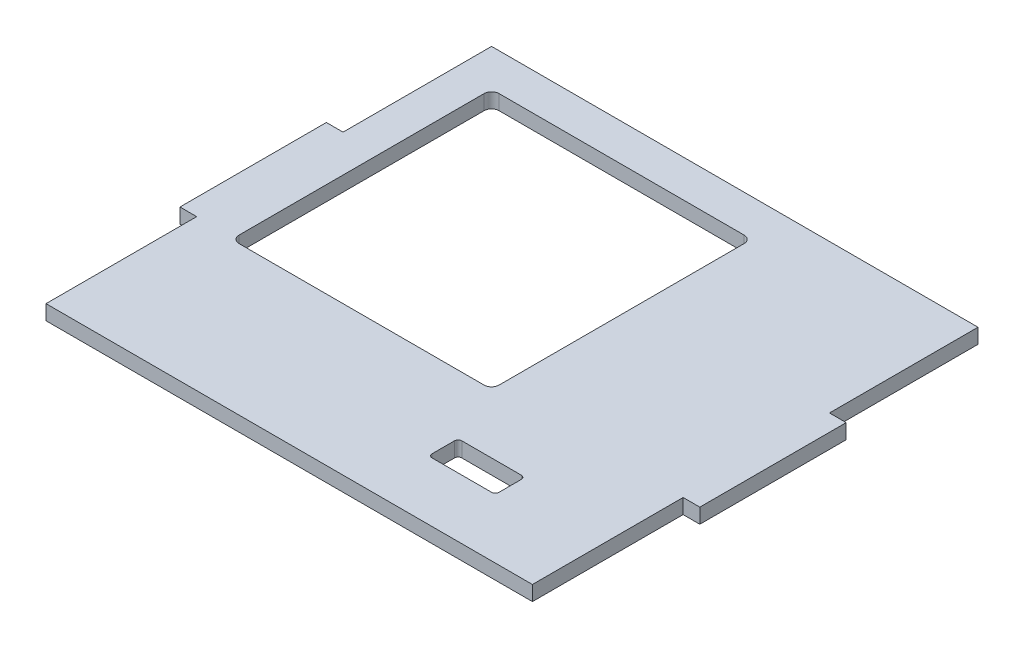
ISO-10303-21;
HEADER;
FILE_DESCRIPTION(('STEP AP214'),'2;1');
FILE_NAME('part.step','',(''),(''),'','','');
FILE_SCHEMA(('AUTOMOTIVE_DESIGN { 1 0 10303 214 1 1 1 1 }'));
ENDSEC;
DATA;
#1=APPLICATION_CONTEXT('core data for automotive mechanical design processes');
#2=APPLICATION_PROTOCOL_DEFINITION('international standard','automotive_design',2000,#1);
#3=PRODUCT_CONTEXT('',#1,'mechanical');
#4=PRODUCT('Part','Part','',(#3));
#5=PRODUCT_RELATED_PRODUCT_CATEGORY('part','',(#4));
#6=PRODUCT_DEFINITION_FORMATION('','',#4);
#7=PRODUCT_DEFINITION_CONTEXT('part definition',#1,'design');
#8=PRODUCT_DEFINITION('design','',#6,#7);
#9=PRODUCT_DEFINITION_SHAPE('','',#8);
#10=(LENGTH_UNIT() NAMED_UNIT(*) SI_UNIT(.MILLI.,.METRE.));
#11=(NAMED_UNIT(*) PLANE_ANGLE_UNIT() SI_UNIT($,.RADIAN.));
#12=(NAMED_UNIT(*) SI_UNIT($,.STERADIAN.) SOLID_ANGLE_UNIT());
#13=UNCERTAINTY_MEASURE_WITH_UNIT(LENGTH_MEASURE(1.E-05),#10,'distance_accuracy_value','');
#14=(GEOMETRIC_REPRESENTATION_CONTEXT(3) GLOBAL_UNCERTAINTY_ASSIGNED_CONTEXT((#13)) GLOBAL_UNIT_ASSIGNED_CONTEXT((#10,
#11,#12)) REPRESENTATION_CONTEXT('',''));
#15=CARTESIAN_POINT('',(0.,0.,0.));
#16=DIRECTION('',(0.,0.,1.));
#17=DIRECTION('',(1.,0.,0.));
#18=AXIS2_PLACEMENT_3D('',#15,#16,#17);
#19=CARTESIAN_POINT('',(65.5,4.,-20.));
#20=DIRECTION('',(-1.,0.,0.));
#21=DIRECTION('',(0.,0.,1.));
#22=AXIS2_PLACEMENT_3D('',#19,#20,#21);
#23=PLANE('',#22);
#24=DIRECTION('',(0.,0.,-1.));
#25=VECTOR('',#24,1.);
#26=CARTESIAN_POINT('',(65.5,0.,-20.));
#27=LINE('',#26,#25);
#28=CARTESIAN_POINT('',(65.5,0.,-20.));
#29=VERTEX_POINT('',#28);
#30=CARTESIAN_POINT('',(65.5,0.,-60.));
#31=VERTEX_POINT('',#30);
#32=EDGE_CURVE('E259',#29,#31,#27,.T.);
#33=ORIENTED_EDGE('',*,*,#32,.T.);
#34=DIRECTION('',(0.,-1.,0.));
#35=VECTOR('',#34,1.);
#36=CARTESIAN_POINT('',(65.5,4.,-60.));
#37=LINE('',#36,#35);
#38=CARTESIAN_POINT('',(65.5,4.,-60.));
#39=VERTEX_POINT('',#38);
#40=EDGE_CURVE('E390',#39,#31,#37,.T.);
#41=ORIENTED_EDGE('',*,*,#40,.F.);
#42=DIRECTION('',(0.,0.,-1.));
#43=VECTOR('',#42,1.);
#44=CARTESIAN_POINT('',(65.5,4.,-20.));
#45=LINE('',#44,#43);
#46=CARTESIAN_POINT('',(65.5,4.,-20.));
#47=VERTEX_POINT('',#46);
#48=EDGE_CURVE('E308',#47,#39,#45,.T.);
#49=ORIENTED_EDGE('',*,*,#48,.F.);
#50=DIRECTION('',(0.,-1.,0.));
#51=VECTOR('',#50,1.);
#52=CARTESIAN_POINT('',(65.5,4.,-20.));
#53=LINE('',#52,#51);
#54=EDGE_CURVE('E334',#47,#29,#53,.T.);
#55=ORIENTED_EDGE('',*,*,#54,.T.);
#56=EDGE_LOOP('',(#33,#41,#49,#55));
#57=FACE_BOUND('',#56,.T.);
#58=ADVANCED_FACE('F32',(#57),#23,.F.);
#59=CARTESIAN_POINT('',(-65.5,4.,-60.));
#60=DIRECTION('',(0.,0.,1.));
#61=DIRECTION('',(1.,0.,0.));
#62=AXIS2_PLACEMENT_3D('',#59,#60,#61);
#63=PLANE('',#62);
#64=DIRECTION('',(-1.,0.,0.));
#65=VECTOR('',#64,1.);
#66=CARTESIAN_POINT('',(-65.5,0.,-60.));
#67=LINE('',#66,#65);
#68=CARTESIAN_POINT('',(-65.5,0.,-60.));
#69=VERTEX_POINT('',#68);
#70=EDGE_CURVE('E337',#31,#69,#67,.T.);
#71=ORIENTED_EDGE('',*,*,#70,.T.);
#72=DIRECTION('',(0.,-1.,0.));
#73=VECTOR('',#72,1.);
#74=CARTESIAN_POINT('',(-65.5,4.,-60.));
#75=LINE('',#74,#73);
#76=CARTESIAN_POINT('',(-65.5,4.,-60.));
#77=VERTEX_POINT('',#76);
#78=EDGE_CURVE('E387',#77,#69,#75,.T.);
#79=ORIENTED_EDGE('',*,*,#78,.F.);
#80=DIRECTION('',(-1.,0.,0.));
#81=VECTOR('',#80,1.);
#82=CARTESIAN_POINT('',(-65.5,4.,-60.));
#83=LINE('',#82,#81);
#84=EDGE_CURVE('E311',#39,#77,#83,.T.);
#85=ORIENTED_EDGE('',*,*,#84,.F.);
#86=ORIENTED_EDGE('',*,*,#40,.T.);
#87=EDGE_LOOP('',(#71,#79,#85,#86));
#88=FACE_BOUND('',#87,.T.);
#89=ADVANCED_FACE('F462',(#88),#63,.F.);
#90=CARTESIAN_POINT('',(-65.5,4.,-20.));
#91=DIRECTION('',(1.,0.,0.));
#92=DIRECTION('',(0.,0.,-1.));
#93=AXIS2_PLACEMENT_3D('',#90,#91,#92);
#94=PLANE('',#93);
#95=DIRECTION('',(0.,0.,1.));
#96=VECTOR('',#95,1.);
#97=CARTESIAN_POINT('',(-65.5,0.,-20.));
#98=LINE('',#97,#96);
#99=CARTESIAN_POINT('',(-65.5,0.,-20.));
#100=VERTEX_POINT('',#99);
#101=EDGE_CURVE('E339',#69,#100,#98,.T.);
#102=ORIENTED_EDGE('',*,*,#101,.T.);
#103=DIRECTION('',(0.,-1.,0.));
#104=VECTOR('',#103,1.);
#105=CARTESIAN_POINT('',(-65.5,4.,-20.));
#106=LINE('',#105,#104);
#107=CARTESIAN_POINT('',(-65.5,4.,-20.));
#108=VERTEX_POINT('',#107);
#109=EDGE_CURVE('E384',#108,#100,#106,.T.);
#110=ORIENTED_EDGE('',*,*,#109,.F.);
#111=DIRECTION('',(0.,0.,1.));
#112=VECTOR('',#111,1.);
#113=CARTESIAN_POINT('',(-65.5,4.,-20.));
#114=LINE('',#113,#112);
#115=EDGE_CURVE('E314',#77,#108,#114,.T.);
#116=ORIENTED_EDGE('',*,*,#115,.F.);
#117=ORIENTED_EDGE('',*,*,#78,.T.);
#118=EDGE_LOOP('',(#102,#110,#116,#117));
#119=FACE_BOUND('',#118,.T.);
#120=ADVANCED_FACE('F467',(#119),#94,.F.);
#121=CARTESIAN_POINT('',(-65.5,4.,-20.));
#122=DIRECTION('',(0.,0.,1.));
#123=DIRECTION('',(1.,0.,0.));
#124=AXIS2_PLACEMENT_3D('',#121,#122,#123);
#125=PLANE('',#124);
#126=DIRECTION('',(-1.,0.,0.));
#127=VECTOR('',#126,1.);
#128=CARTESIAN_POINT('',(-65.5,0.,-20.));
#129=LINE('',#128,#127);
#130=CARTESIAN_POINT('',(-70.,0.,-20.));
#131=VERTEX_POINT('',#130);
#132=EDGE_CURVE('E341',#100,#131,#129,.T.);
#133=ORIENTED_EDGE('',*,*,#132,.T.);
#134=DIRECTION('',(0.,-1.,0.));
#135=VECTOR('',#134,1.);
#136=CARTESIAN_POINT('',(-70.,4.,-20.));
#137=LINE('',#136,#135);
#138=CARTESIAN_POINT('',(-70.,4.,-20.));
#139=VERTEX_POINT('',#138);
#140=EDGE_CURVE('E381',#139,#131,#137,.T.);
#141=ORIENTED_EDGE('',*,*,#140,.F.);
#142=DIRECTION('',(-1.,0.,0.));
#143=VECTOR('',#142,1.);
#144=CARTESIAN_POINT('',(-65.5,4.,-20.));
#145=LINE('',#144,#143);
#146=EDGE_CURVE('E316',#108,#139,#145,.T.);
#147=ORIENTED_EDGE('',*,*,#146,.F.);
#148=ORIENTED_EDGE('',*,*,#109,.T.);
#149=EDGE_LOOP('',(#133,#141,#147,#148));
#150=FACE_BOUND('',#149,.T.);
#151=ADVANCED_FACE('F520',(#150),#125,.F.);
#152=CARTESIAN_POINT('',(-70.,4.,-20.));
#153=DIRECTION('',(1.,0.,0.));
#154=DIRECTION('',(0.,0.,-1.));
#155=AXIS2_PLACEMENT_3D('',#152,#153,#154);
#156=PLANE('',#155);
#157=DIRECTION('',(0.,0.,1.));
#158=VECTOR('',#157,1.);
#159=CARTESIAN_POINT('',(-70.,0.,-20.));
#160=LINE('',#159,#158);
#161=CARTESIAN_POINT('',(-70.,0.,19.4155154362416));
#162=VERTEX_POINT('',#161);
#163=EDGE_CURVE('E343',#131,#162,#160,.T.);
#164=ORIENTED_EDGE('',*,*,#163,.T.);
#165=DIRECTION('',(0.,-1.,0.));
#166=VECTOR('',#165,1.);
#167=CARTESIAN_POINT('',(-70.,4.,19.4155154362416));
#168=LINE('',#167,#166);
#169=CARTESIAN_POINT('',(-70.,4.,19.4155154362416));
#170=VERTEX_POINT('',#169);
#171=EDGE_CURVE('E378',#170,#162,#168,.T.);
#172=ORIENTED_EDGE('',*,*,#171,.F.);
#173=DIRECTION('',(0.,0.,1.));
#174=VECTOR('',#173,1.);
#175=CARTESIAN_POINT('',(-70.,4.,-20.));
#176=LINE('',#175,#174);
#177=EDGE_CURVE('E318',#139,#170,#176,.T.);
#178=ORIENTED_EDGE('',*,*,#177,.F.);
#179=ORIENTED_EDGE('',*,*,#140,.T.);
#180=EDGE_LOOP('',(#164,#172,#178,#179));
#181=FACE_BOUND('',#180,.T.);
#182=ADVANCED_FACE('F517',(#181),#156,.F.);
#183=CARTESIAN_POINT('',(-70.,4.,19.4155154362416));
#184=DIRECTION('',(0.,0.,-1.));
#185=DIRECTION('',(-1.,0.,0.));
#186=AXIS2_PLACEMENT_3D('',#183,#184,#185);
#187=PLANE('',#186);
#188=DIRECTION('',(1.,0.,0.));
#189=VECTOR('',#188,1.);
#190=CARTESIAN_POINT('',(-70.,0.,19.4155154362416));
#191=LINE('',#190,#189);
#192=CARTESIAN_POINT('',(-65.5,0.,19.4155154362416));
#193=VERTEX_POINT('',#192);
#194=EDGE_CURVE('E345',#162,#193,#191,.T.);
#195=ORIENTED_EDGE('',*,*,#194,.T.);
#196=DIRECTION('',(0.,-1.,0.));
#197=VECTOR('',#196,1.);
#198=CARTESIAN_POINT('',(-65.5,4.,19.4155154362416));
#199=LINE('',#198,#197);
#200=CARTESIAN_POINT('',(-65.5,4.,19.4155154362416));
#201=VERTEX_POINT('',#200);
#202=EDGE_CURVE('E375',#201,#193,#199,.T.);
#203=ORIENTED_EDGE('',*,*,#202,.F.);
#204=DIRECTION('',(1.,0.,0.));
#205=VECTOR('',#204,1.);
#206=CARTESIAN_POINT('',(-70.,4.,19.4155154362416));
#207=LINE('',#206,#205);
#208=EDGE_CURVE('E320',#170,#201,#207,.T.);
#209=ORIENTED_EDGE('',*,*,#208,.F.);
#210=ORIENTED_EDGE('',*,*,#171,.T.);
#211=EDGE_LOOP('',(#195,#203,#209,#210));
#212=FACE_BOUND('',#211,.T.);
#213=ADVANCED_FACE('F513',(#212),#187,.F.);
#214=CARTESIAN_POINT('',(-65.5,4.,60.));
#215=DIRECTION('',(1.,0.,0.));
#216=DIRECTION('',(0.,0.,-1.));
#217=AXIS2_PLACEMENT_3D('',#214,#215,#216);
#218=PLANE('',#217);
#219=DIRECTION('',(0.,0.,1.));
#220=VECTOR('',#219,1.);
#221=CARTESIAN_POINT('',(-65.5,0.,60.));
#222=LINE('',#221,#220);
#223=CARTESIAN_POINT('',(-65.5,0.,60.));
#224=VERTEX_POINT('',#223);
#225=EDGE_CURVE('E347',#193,#224,#222,.T.);
#226=ORIENTED_EDGE('',*,*,#225,.T.);
#227=DIRECTION('',(0.,-1.,0.));
#228=VECTOR('',#227,1.);
#229=CARTESIAN_POINT('',(-65.5,4.,60.));
#230=LINE('',#229,#228);
#231=CARTESIAN_POINT('',(-65.5,4.,60.));
#232=VERTEX_POINT('',#231);
#233=EDGE_CURVE('E372',#232,#224,#230,.T.);
#234=ORIENTED_EDGE('',*,*,#233,.F.);
#235=DIRECTION('',(0.,0.,1.));
#236=VECTOR('',#235,1.);
#237=CARTESIAN_POINT('',(-65.5,4.,60.));
#238=LINE('',#237,#236);
#239=EDGE_CURVE('E322',#201,#232,#238,.T.);
#240=ORIENTED_EDGE('',*,*,#239,.F.);
#241=ORIENTED_EDGE('',*,*,#202,.T.);
#242=EDGE_LOOP('',(#226,#234,#240,#241));
#243=FACE_BOUND('',#242,.T.);
#244=ADVANCED_FACE('F508',(#243),#218,.F.);
#245=CARTESIAN_POINT('',(-65.5,4.,60.));
#246=DIRECTION('',(0.,0.,-1.));
#247=DIRECTION('',(-1.,0.,0.));
#248=AXIS2_PLACEMENT_3D('',#245,#246,#247);
#249=PLANE('',#248);
#250=DIRECTION('',(1.,0.,0.));
#251=VECTOR('',#250,1.);
#252=CARTESIAN_POINT('',(-65.5,0.,60.));
#253=LINE('',#252,#251);
#254=CARTESIAN_POINT('',(65.5,0.,60.));
#255=VERTEX_POINT('',#254);
#256=EDGE_CURVE('E349',#224,#255,#253,.T.);
#257=ORIENTED_EDGE('',*,*,#256,.T.);
#258=DIRECTION('',(0.,-1.,0.));
#259=VECTOR('',#258,1.);
#260=CARTESIAN_POINT('',(65.5,4.,60.));
#261=LINE('',#260,#259);
#262=CARTESIAN_POINT('',(65.5,4.,60.));
#263=VERTEX_POINT('',#262);
#264=EDGE_CURVE('E369',#263,#255,#261,.T.);
#265=ORIENTED_EDGE('',*,*,#264,.F.);
#266=DIRECTION('',(1.,0.,0.));
#267=VECTOR('',#266,1.);
#268=CARTESIAN_POINT('',(-65.5,4.,60.));
#269=LINE('',#268,#267);
#270=EDGE_CURVE('E324',#232,#263,#269,.T.);
#271=ORIENTED_EDGE('',*,*,#270,.F.);
#272=ORIENTED_EDGE('',*,*,#233,.T.);
#273=EDGE_LOOP('',(#257,#265,#271,#272));
#274=FACE_BOUND('',#273,.T.);
#275=ADVANCED_FACE('F502',(#274),#249,.F.);
#276=CARTESIAN_POINT('',(65.5,4.,60.));
#277=DIRECTION('',(-1.,0.,0.));
#278=DIRECTION('',(0.,0.,1.));
#279=AXIS2_PLACEMENT_3D('',#276,#277,#278);
#280=PLANE('',#279);
#281=DIRECTION('',(0.,0.,-1.));
#282=VECTOR('',#281,1.);
#283=CARTESIAN_POINT('',(65.5,0.,60.));
#284=LINE('',#283,#282);
#285=CARTESIAN_POINT('',(65.5,0.,19.4155154362416));
#286=VERTEX_POINT('',#285);
#287=EDGE_CURVE('E351',#255,#286,#284,.T.);
#288=ORIENTED_EDGE('',*,*,#287,.T.);
#289=DIRECTION('',(0.,-1.,0.));
#290=VECTOR('',#289,1.);
#291=CARTESIAN_POINT('',(65.5,4.,19.4155154362416));
#292=LINE('',#291,#290);
#293=CARTESIAN_POINT('',(65.5,4.,19.4155154362416));
#294=VERTEX_POINT('',#293);
#295=EDGE_CURVE('E366',#294,#286,#292,.T.);
#296=ORIENTED_EDGE('',*,*,#295,.F.);
#297=DIRECTION('',(0.,0.,-1.));
#298=VECTOR('',#297,1.);
#299=CARTESIAN_POINT('',(65.5,4.,60.));
#300=LINE('',#299,#298);
#301=EDGE_CURVE('E326',#263,#294,#300,.T.);
#302=ORIENTED_EDGE('',*,*,#301,.F.);
#303=ORIENTED_EDGE('',*,*,#264,.T.);
#304=EDGE_LOOP('',(#288,#296,#302,#303));
#305=FACE_BOUND('',#304,.T.);
#306=ADVANCED_FACE('F498',(#305),#280,.F.);
#307=CARTESIAN_POINT('',(70.,4.,19.4155154362416));
#308=DIRECTION('',(0.,0.,-1.));
#309=DIRECTION('',(-1.,0.,0.));
#310=AXIS2_PLACEMENT_3D('',#307,#308,#309);
#311=PLANE('',#310);
#312=DIRECTION('',(1.,0.,0.));
#313=VECTOR('',#312,1.);
#314=CARTESIAN_POINT('',(70.,0.,19.4155154362416));
#315=LINE('',#314,#313);
#316=CARTESIAN_POINT('',(70.,0.,19.4155154362416));
#317=VERTEX_POINT('',#316);
#318=EDGE_CURVE('E353',#286,#317,#315,.T.);
#319=ORIENTED_EDGE('',*,*,#318,.T.);
#320=DIRECTION('',(0.,-1.,0.));
#321=VECTOR('',#320,1.);
#322=CARTESIAN_POINT('',(70.,4.,19.4155154362416));
#323=LINE('',#322,#321);
#324=CARTESIAN_POINT('',(70.,4.,19.4155154362416));
#325=VERTEX_POINT('',#324);
#326=EDGE_CURVE('E363',#325,#317,#323,.T.);
#327=ORIENTED_EDGE('',*,*,#326,.F.);
#328=DIRECTION('',(1.,0.,0.));
#329=VECTOR('',#328,1.);
#330=CARTESIAN_POINT('',(70.,4.,19.4155154362416));
#331=LINE('',#330,#329);
#332=EDGE_CURVE('E328',#294,#325,#331,.T.);
#333=ORIENTED_EDGE('',*,*,#332,.F.);
#334=ORIENTED_EDGE('',*,*,#295,.T.);
#335=EDGE_LOOP('',(#319,#327,#333,#334));
#336=FACE_BOUND('',#335,.T.);
#337=ADVANCED_FACE('F493',(#336),#311,.F.);
#338=CARTESIAN_POINT('',(70.,4.,-20.));
#339=DIRECTION('',(-1.,0.,0.));
#340=DIRECTION('',(0.,0.,1.));
#341=AXIS2_PLACEMENT_3D('',#338,#339,#340);
#342=PLANE('',#341);
#343=DIRECTION('',(0.,0.,-1.));
#344=VECTOR('',#343,1.);
#345=CARTESIAN_POINT('',(70.,0.,-20.));
#346=LINE('',#345,#344);
#347=CARTESIAN_POINT('',(70.,0.,-20.));
#348=VERTEX_POINT('',#347);
#349=EDGE_CURVE('E355',#317,#348,#346,.T.);
#350=ORIENTED_EDGE('',*,*,#349,.T.);
#351=DIRECTION('',(0.,-1.,0.));
#352=VECTOR('',#351,1.);
#353=CARTESIAN_POINT('',(70.,4.,-20.));
#354=LINE('',#353,#352);
#355=CARTESIAN_POINT('',(70.,4.,-20.));
#356=VERTEX_POINT('',#355);
#357=EDGE_CURVE('E360',#356,#348,#354,.T.);
#358=ORIENTED_EDGE('',*,*,#357,.F.);
#359=DIRECTION('',(0.,0.,-1.));
#360=VECTOR('',#359,1.);
#361=CARTESIAN_POINT('',(70.,4.,-20.));
#362=LINE('',#361,#360);
#363=EDGE_CURVE('E330',#325,#356,#362,.T.);
#364=ORIENTED_EDGE('',*,*,#363,.F.);
#365=ORIENTED_EDGE('',*,*,#326,.T.);
#366=EDGE_LOOP('',(#350,#358,#364,#365));
#367=FACE_BOUND('',#366,.T.);
#368=ADVANCED_FACE('F487',(#367),#342,.F.);
#369=CARTESIAN_POINT('',(65.5,4.,-20.));
#370=DIRECTION('',(0.,0.,1.));
#371=DIRECTION('',(1.,0.,0.));
#372=AXIS2_PLACEMENT_3D('',#369,#370,#371);
#373=PLANE('',#372);
#374=DIRECTION('',(-1.,0.,0.));
#375=VECTOR('',#374,1.);
#376=CARTESIAN_POINT('',(65.5,0.,-20.));
#377=LINE('',#376,#375);
#378=EDGE_CURVE('E312',#348,#29,#377,.T.);
#379=ORIENTED_EDGE('',*,*,#378,.T.);
#380=ORIENTED_EDGE('',*,*,#54,.F.);
#381=DIRECTION('',(-1.,0.,0.));
#382=VECTOR('',#381,1.);
#383=CARTESIAN_POINT('',(65.5,4.,-20.));
#384=LINE('',#383,#382);
#385=EDGE_CURVE('E332',#356,#47,#384,.T.);
#386=ORIENTED_EDGE('',*,*,#385,.F.);
#387=ORIENTED_EDGE('',*,*,#357,.T.);
#388=EDGE_LOOP('',(#379,#380,#386,#387));
#389=FACE_BOUND('',#388,.T.);
#390=ADVANCED_FACE('F485',(#389),#373,.F.);
#391=CARTESIAN_POINT('',(0.,4.,0.));
#392=DIRECTION('',(0.,-1.,0.));
#393=DIRECTION('',(0.,0.,-1.));
#394=AXIS2_PLACEMENT_3D('',#391,#392,#393);
#395=PLANE('',#394);
#396=DIRECTION('',(-1.,0.,0.));
#397=VECTOR('',#396,1.);
#398=CARTESIAN_POINT('',(-53.5,4.,-50.));
#399=LINE('',#398,#397);
#400=CARTESIAN_POINT('',(12.5,4.,-50.));
#401=VERTEX_POINT('',#400);
#402=CARTESIAN_POINT('',(-53.5,4.,-50.));
#403=VERTEX_POINT('',#402);
#404=EDGE_CURVE('E232',#401,#403,#399,.T.);
#405=ORIENTED_EDGE('',*,*,#404,.F.);
#406=CARTESIAN_POINT('',(12.5,4.,-48.));
#407=DIRECTION('',(0.,1.,0.));
#408=DIRECTION('',(0.,0.,-1.));
#409=AXIS2_PLACEMENT_3D('',#406,#407,#408);
#410=CIRCLE('',#409,2.);
#411=CARTESIAN_POINT('',(14.5,4.,-48.));
#412=VERTEX_POINT('',#411);
#413=EDGE_CURVE('E46',#412,#401,#410,.T.);
#414=ORIENTED_EDGE('',*,*,#413,.F.);
#415=DIRECTION('',(0.,0.,-1.));
#416=VECTOR('',#415,1.);
#417=CARTESIAN_POINT('',(14.5,4.,18.));
#418=LINE('',#417,#416);
#419=CARTESIAN_POINT('',(14.5,4.,18.));
#420=VERTEX_POINT('',#419);
#421=EDGE_CURVE('E254',#420,#412,#418,.T.);
#422=ORIENTED_EDGE('',*,*,#421,.F.);
#423=CARTESIAN_POINT('',(12.5,4.,18.));
#424=DIRECTION('',(0.,1.,0.));
#425=DIRECTION('',(0.,0.,-1.));
#426=AXIS2_PLACEMENT_3D('',#423,#424,#425);
#427=CIRCLE('',#426,2.);
#428=CARTESIAN_POINT('',(12.5,4.,20.));
#429=VERTEX_POINT('',#428);
#430=EDGE_CURVE('E251',#429,#420,#427,.T.);
#431=ORIENTED_EDGE('',*,*,#430,.F.);
#432=DIRECTION('',(1.,0.,0.));
#433=VECTOR('',#432,1.);
#434=CARTESIAN_POINT('',(-53.5,4.,20.));
#435=LINE('',#434,#433);
#436=CARTESIAN_POINT('',(-53.5,4.,20.));
#437=VERTEX_POINT('',#436);
#438=EDGE_CURVE('E248',#437,#429,#435,.T.);
#439=ORIENTED_EDGE('',*,*,#438,.F.);
#440=CARTESIAN_POINT('',(-53.5,4.,18.));
#441=DIRECTION('',(0.,1.,0.));
#442=DIRECTION('',(0.,0.,-1.));
#443=AXIS2_PLACEMENT_3D('',#440,#441,#442);
#444=CIRCLE('',#443,2.);
#445=CARTESIAN_POINT('',(-55.5,4.,18.));
#446=VERTEX_POINT('',#445);
#447=EDGE_CURVE('E242',#446,#437,#444,.T.);
#448=ORIENTED_EDGE('',*,*,#447,.F.);
#449=DIRECTION('',(0.,0.,1.));
#450=VECTOR('',#449,1.);
#451=CARTESIAN_POINT('',(-55.5,4.,18.));
#452=LINE('',#451,#450);
#453=CARTESIAN_POINT('',(-55.5,4.,-48.));
#454=VERTEX_POINT('',#453);
#455=EDGE_CURVE('E240',#454,#446,#452,.T.);
#456=ORIENTED_EDGE('',*,*,#455,.F.);
#457=CARTESIAN_POINT('',(-53.5,4.,-48.));
#458=DIRECTION('',(0.,1.,0.));
#459=DIRECTION('',(0.,0.,-1.));
#460=AXIS2_PLACEMENT_3D('',#457,#458,#459);
#461=CIRCLE('',#460,2.);
#462=EDGE_CURVE('E222',#403,#454,#461,.T.);
#463=ORIENTED_EDGE('',*,*,#462,.F.);
#464=EDGE_LOOP('',(#405,#414,#422,#431,#439,#448,#456,#463));
#465=FACE_BOUND('',#464,.T.);
#466=DIRECTION('',(1.,0.,0.));
#467=VECTOR('',#466,1.);
#468=CARTESIAN_POINT('',(22.5,4.,44.));
#469=LINE('',#468,#467);
#470=CARTESIAN_POINT('',(22.5,4.,44.));
#471=VERTEX_POINT('',#470);
#472=CARTESIAN_POINT('',(38.5,4.,44.));
#473=VERTEX_POINT('',#472);
#474=EDGE_CURVE('E271',#471,#473,#469,.T.);
#475=ORIENTED_EDGE('',*,*,#474,.F.);
#476=CARTESIAN_POINT('',(22.5,4.,43.));
#477=DIRECTION('',(0.,1.,0.));
#478=DIRECTION('',(0.,0.,1.));
#479=AXIS2_PLACEMENT_3D('',#476,#477,#478);
#480=CIRCLE('',#479,1.);
#481=CARTESIAN_POINT('',(21.5,4.,43.));
#482=VERTEX_POINT('',#481);
#483=EDGE_CURVE('E54',#482,#471,#480,.T.);
#484=ORIENTED_EDGE('',*,*,#483,.F.);
#485=DIRECTION('',(0.,0.,1.));
#486=VECTOR('',#485,1.);
#487=CARTESIAN_POINT('',(21.5,4.,43.));
#488=LINE('',#487,#486);
#489=CARTESIAN_POINT('',(21.5,4.,37.));
#490=VERTEX_POINT('',#489);
#491=EDGE_CURVE('E289',#490,#482,#488,.T.);
#492=ORIENTED_EDGE('',*,*,#491,.F.);
#493=CARTESIAN_POINT('',(22.5,4.,37.));
#494=DIRECTION('',(0.,1.,0.));
#495=DIRECTION('',(0.,0.,-1.));
#496=AXIS2_PLACEMENT_3D('',#493,#494,#495);
#497=CIRCLE('',#496,1.);
#498=CARTESIAN_POINT('',(22.5,4.,36.));
#499=VERTEX_POINT('',#498);
#500=EDGE_CURVE('E286',#499,#490,#497,.T.);
#501=ORIENTED_EDGE('',*,*,#500,.F.);
#502=DIRECTION('',(-1.,0.,0.));
#503=VECTOR('',#502,1.);
#504=CARTESIAN_POINT('',(22.5,4.,36.));
#505=LINE('',#504,#503);
#506=CARTESIAN_POINT('',(38.5,4.,36.));
#507=VERTEX_POINT('',#506);
#508=EDGE_CURVE('E283',#507,#499,#505,.T.);
#509=ORIENTED_EDGE('',*,*,#508,.F.);
#510=CARTESIAN_POINT('',(38.5,4.,37.));
#511=DIRECTION('',(0.,1.,0.));
#512=DIRECTION('',(0.,0.,1.));
#513=AXIS2_PLACEMENT_3D('',#510,#511,#512);
#514=CIRCLE('',#513,1.);
#515=CARTESIAN_POINT('',(39.5,4.,37.));
#516=VERTEX_POINT('',#515);
#517=EDGE_CURVE('E280',#516,#507,#514,.T.);
#518=ORIENTED_EDGE('',*,*,#517,.F.);
#519=DIRECTION('',(0.,0.,-1.));
#520=VECTOR('',#519,1.);
#521=CARTESIAN_POINT('',(39.5,4.,43.));
#522=LINE('',#521,#520);
#523=CARTESIAN_POINT('',(39.5,4.,43.));
#524=VERTEX_POINT('',#523);
#525=EDGE_CURVE('E277',#524,#516,#522,.T.);
#526=ORIENTED_EDGE('',*,*,#525,.F.);
#527=CARTESIAN_POINT('',(38.5,4.,43.));
#528=DIRECTION('',(0.,1.,0.));
#529=DIRECTION('',(0.,0.,1.));
#530=AXIS2_PLACEMENT_3D('',#527,#528,#529);
#531=CIRCLE('',#530,1.);
#532=EDGE_CURVE('E274',#473,#524,#531,.T.);
#533=ORIENTED_EDGE('',*,*,#532,.F.);
#534=EDGE_LOOP('',(#475,#484,#492,#501,#509,#518,#526,#533));
#535=FACE_BOUND('',#534,.T.);
#536=ORIENTED_EDGE('',*,*,#48,.T.);
#537=ORIENTED_EDGE('',*,*,#84,.T.);
#538=ORIENTED_EDGE('',*,*,#115,.T.);
#539=ORIENTED_EDGE('',*,*,#146,.T.);
#540=ORIENTED_EDGE('',*,*,#177,.T.);
#541=ORIENTED_EDGE('',*,*,#208,.T.);
#542=ORIENTED_EDGE('',*,*,#239,.T.);
#543=ORIENTED_EDGE('',*,*,#270,.T.);
#544=ORIENTED_EDGE('',*,*,#301,.T.);
#545=ORIENTED_EDGE('',*,*,#332,.T.);
#546=ORIENTED_EDGE('',*,*,#363,.T.);
#547=ORIENTED_EDGE('',*,*,#385,.T.);
#548=EDGE_LOOP('',(#536,#537,#538,#539,#540,#541,#542,#543,#544,#545,#546,#547));
#549=FACE_BOUND('',#548,.T.);
#550=ADVANCED_FACE('F236',(#465,#535,#549),#395,.F.);
#551=CARTESIAN_POINT('',(0.,0.,0.));
#552=DIRECTION('',(0.,-1.,0.));
#553=DIRECTION('',(0.,0.,-1.));
#554=AXIS2_PLACEMENT_3D('',#551,#552,#553);
#555=PLANE('',#554);
#556=CARTESIAN_POINT('',(12.5,0.,-48.));
#557=DIRECTION('',(0.,-1.,0.));
#558=DIRECTION('',(0.,0.,-1.));
#559=AXIS2_PLACEMENT_3D('',#556,#557,#558);
#560=CIRCLE('',#559,2.);
#561=CARTESIAN_POINT('',(12.5,0.,-50.));
#562=VERTEX_POINT('',#561);
#563=CARTESIAN_POINT('',(14.5,0.,-48.));
#564=VERTEX_POINT('',#563);
#565=EDGE_CURVE('E11',#562,#564,#560,.T.);
#566=ORIENTED_EDGE('',*,*,#565,.F.);
#567=DIRECTION('',(1.,0.,0.));
#568=VECTOR('',#567,1.);
#569=CARTESIAN_POINT('',(0.,0.,-50.));
#570=LINE('',#569,#568);
#571=CARTESIAN_POINT('',(-53.5,0.,-50.));
#572=VERTEX_POINT('',#571);
#573=EDGE_CURVE('E410',#572,#562,#570,.T.);
#574=ORIENTED_EDGE('',*,*,#573,.F.);
#575=CARTESIAN_POINT('',(-53.5,0.,-48.));
#576=DIRECTION('',(0.,-1.,0.));
#577=DIRECTION('',(0.,0.,-1.));
#578=AXIS2_PLACEMENT_3D('',#575,#576,#577);
#579=CIRCLE('',#578,2.);
#580=CARTESIAN_POINT('',(-55.5,0.,-48.));
#581=VERTEX_POINT('',#580);
#582=EDGE_CURVE('E225',#581,#572,#579,.T.);
#583=ORIENTED_EDGE('',*,*,#582,.F.);
#584=DIRECTION('',(0.,0.,-1.));
#585=VECTOR('',#584,1.);
#586=CARTESIAN_POINT('',(-55.5,0.,0.));
#587=LINE('',#586,#585);
#588=CARTESIAN_POINT('',(-55.5,0.,18.));
#589=VERTEX_POINT('',#588);
#590=EDGE_CURVE('E413',#589,#581,#587,.T.);
#591=ORIENTED_EDGE('',*,*,#590,.F.);
#592=CARTESIAN_POINT('',(-53.5,0.,18.));
#593=DIRECTION('',(0.,-1.,0.));
#594=DIRECTION('',(0.,0.,-1.));
#595=AXIS2_PLACEMENT_3D('',#592,#593,#594);
#596=CIRCLE('',#595,2.);
#597=CARTESIAN_POINT('',(-53.5,0.,20.));
#598=VERTEX_POINT('',#597);
#599=EDGE_CURVE('E415',#598,#589,#596,.T.);
#600=ORIENTED_EDGE('',*,*,#599,.F.);
#601=DIRECTION('',(-1.,0.,0.));
#602=VECTOR('',#601,1.);
#603=CARTESIAN_POINT('',(0.,0.,20.));
#604=LINE('',#603,#602);
#605=CARTESIAN_POINT('',(12.5,0.,20.));
#606=VERTEX_POINT('',#605);
#607=EDGE_CURVE('E417',#606,#598,#604,.T.);
#608=ORIENTED_EDGE('',*,*,#607,.F.);
#609=CARTESIAN_POINT('',(12.5,0.,18.));
#610=DIRECTION('',(0.,-1.,0.));
#611=DIRECTION('',(0.,0.,-1.));
#612=AXIS2_PLACEMENT_3D('',#609,#610,#611);
#613=CIRCLE('',#612,2.);
#614=CARTESIAN_POINT('',(14.5,0.,18.));
#615=VERTEX_POINT('',#614);
#616=EDGE_CURVE('E419',#615,#606,#613,.T.);
#617=ORIENTED_EDGE('',*,*,#616,.F.);
#618=DIRECTION('',(0.,0.,1.));
#619=VECTOR('',#618,1.);
#620=CARTESIAN_POINT('',(14.5,0.,0.));
#621=LINE('',#620,#619);
#622=EDGE_CURVE('E39',#564,#615,#621,.T.);
#623=ORIENTED_EDGE('',*,*,#622,.F.);
#624=EDGE_LOOP('',(#566,#574,#583,#591,#600,#608,#617,#623));
#625=FACE_BOUND('',#624,.T.);
#626=CARTESIAN_POINT('',(22.5,0.,43.));
#627=DIRECTION('',(0.,-1.,0.));
#628=DIRECTION('',(0.,0.,-1.));
#629=AXIS2_PLACEMENT_3D('',#626,#627,#628);
#630=CIRCLE('',#629,1.);
#631=CARTESIAN_POINT('',(22.5,0.,44.));
#632=VERTEX_POINT('',#631);
#633=CARTESIAN_POINT('',(21.5,0.,43.));
#634=VERTEX_POINT('',#633);
#635=EDGE_CURVE('E408',#632,#634,#630,.T.);
#636=ORIENTED_EDGE('',*,*,#635,.F.);
#637=DIRECTION('',(-1.,0.,0.));
#638=VECTOR('',#637,1.);
#639=CARTESIAN_POINT('',(0.,0.,44.));
#640=LINE('',#639,#638);
#641=CARTESIAN_POINT('',(38.5,0.,44.));
#642=VERTEX_POINT('',#641);
#643=EDGE_CURVE('E393',#642,#632,#640,.T.);
#644=ORIENTED_EDGE('',*,*,#643,.F.);
#645=CARTESIAN_POINT('',(38.5,0.,43.));
#646=DIRECTION('',(0.,-1.,0.));
#647=DIRECTION('',(0.,0.,-1.));
#648=AXIS2_PLACEMENT_3D('',#645,#646,#647);
#649=CIRCLE('',#648,1.);
#650=CARTESIAN_POINT('',(39.5,0.,43.));
#651=VERTEX_POINT('',#650);
#652=EDGE_CURVE('E395',#651,#642,#649,.T.);
#653=ORIENTED_EDGE('',*,*,#652,.F.);
#654=DIRECTION('',(0.,0.,1.));
#655=VECTOR('',#654,1.);
#656=CARTESIAN_POINT('',(39.5,0.,0.));
#657=LINE('',#656,#655);
#658=CARTESIAN_POINT('',(39.5,0.,37.));
#659=VERTEX_POINT('',#658);
#660=EDGE_CURVE('E398',#659,#651,#657,.T.);
#661=ORIENTED_EDGE('',*,*,#660,.F.);
#662=CARTESIAN_POINT('',(38.5,0.,37.));
#663=DIRECTION('',(0.,-1.,0.));
#664=DIRECTION('',(0.,0.,-1.));
#665=AXIS2_PLACEMENT_3D('',#662,#663,#664);
#666=CIRCLE('',#665,1.);
#667=CARTESIAN_POINT('',(38.5,0.,36.));
#668=VERTEX_POINT('',#667);
#669=EDGE_CURVE('E400',#668,#659,#666,.T.);
#670=ORIENTED_EDGE('',*,*,#669,.F.);
#671=DIRECTION('',(1.,0.,0.));
#672=VECTOR('',#671,1.);
#673=CARTESIAN_POINT('',(0.,0.,36.));
#674=LINE('',#673,#672);
#675=CARTESIAN_POINT('',(22.5,0.,36.));
#676=VERTEX_POINT('',#675);
#677=EDGE_CURVE('E402',#676,#668,#674,.T.);
#678=ORIENTED_EDGE('',*,*,#677,.F.);
#679=CARTESIAN_POINT('',(22.5,0.,37.));
#680=DIRECTION('',(0.,-1.,0.));
#681=DIRECTION('',(0.,0.,-1.));
#682=AXIS2_PLACEMENT_3D('',#679,#680,#681);
#683=CIRCLE('',#682,1.);
#684=CARTESIAN_POINT('',(21.5,0.,37.));
#685=VERTEX_POINT('',#684);
#686=EDGE_CURVE('E404',#685,#676,#683,.T.);
#687=ORIENTED_EDGE('',*,*,#686,.F.);
#688=DIRECTION('',(0.,0.,-1.));
#689=VECTOR('',#688,1.);
#690=CARTESIAN_POINT('',(21.5,0.,0.));
#691=LINE('',#690,#689);
#692=EDGE_CURVE('E406',#634,#685,#691,.T.);
#693=ORIENTED_EDGE('',*,*,#692,.F.);
#694=EDGE_LOOP('',(#636,#644,#653,#661,#670,#678,#687,#693));
#695=FACE_BOUND('',#694,.T.);
#696=ORIENTED_EDGE('',*,*,#32,.F.);
#697=ORIENTED_EDGE('',*,*,#378,.F.);
#698=ORIENTED_EDGE('',*,*,#349,.F.);
#699=ORIENTED_EDGE('',*,*,#318,.F.);
#700=ORIENTED_EDGE('',*,*,#287,.F.);
#701=ORIENTED_EDGE('',*,*,#256,.F.);
#702=ORIENTED_EDGE('',*,*,#225,.F.);
#703=ORIENTED_EDGE('',*,*,#194,.F.);
#704=ORIENTED_EDGE('',*,*,#163,.F.);
#705=ORIENTED_EDGE('',*,*,#132,.F.);
#706=ORIENTED_EDGE('',*,*,#101,.F.);
#707=ORIENTED_EDGE('',*,*,#70,.F.);
#708=EDGE_LOOP('',(#696,#697,#698,#699,#700,#701,#702,#703,#704,#705,#706,#707));
#709=FACE_BOUND('',#708,.T.);
#710=ADVANCED_FACE('F434',(#625,#695,#709),#555,.T.);
#711=CARTESIAN_POINT('',(22.5,-1.,43.));
#712=DIRECTION('',(0.,1.,0.));
#713=DIRECTION('',(0.,0.,1.));
#714=AXIS2_PLACEMENT_3D('',#711,#712,#713);
#715=CYLINDRICAL_SURFACE('',#714,1.);
#716=ORIENTED_EDGE('',*,*,#635,.T.);
#717=DIRECTION('',(0.,1.,0.));
#718=VECTOR('',#717,1.);
#719=CARTESIAN_POINT('',(21.5,-1.,43.));
#720=LINE('',#719,#718);
#721=EDGE_CURVE('E293',#634,#482,#720,.T.);
#722=ORIENTED_EDGE('',*,*,#721,.T.);
#723=ORIENTED_EDGE('',*,*,#483,.T.);
#724=DIRECTION('',(0.,1.,0.));
#725=VECTOR('',#724,1.);
#726=CARTESIAN_POINT('',(22.5,-1.,44.));
#727=LINE('',#726,#725);
#728=EDGE_CURVE('E292',#632,#471,#727,.T.);
#729=ORIENTED_EDGE('',*,*,#728,.F.);
#730=EDGE_LOOP('',(#716,#722,#723,#729));
#731=FACE_BOUND('',#730,.T.);
#732=ADVANCED_FACE('F549',(#731),#715,.F.);
#733=CARTESIAN_POINT('',(21.5,-1.,43.));
#734=DIRECTION('',(-1.,0.,0.));
#735=DIRECTION('',(0.,0.,1.));
#736=AXIS2_PLACEMENT_3D('',#733,#734,#735);
#737=PLANE('',#736);
#738=ORIENTED_EDGE('',*,*,#692,.T.);
#739=DIRECTION('',(0.,1.,0.));
#740=VECTOR('',#739,1.);
#741=CARTESIAN_POINT('',(21.5,-1.,37.));
#742=LINE('',#741,#740);
#743=EDGE_CURVE('E295',#685,#490,#742,.T.);
#744=ORIENTED_EDGE('',*,*,#743,.T.);
#745=ORIENTED_EDGE('',*,*,#491,.T.);
#746=ORIENTED_EDGE('',*,*,#721,.F.);
#747=EDGE_LOOP('',(#738,#744,#745,#746));
#748=FACE_BOUND('',#747,.T.);
#749=ADVANCED_FACE('F553',(#748),#737,.F.);
#750=CARTESIAN_POINT('',(22.5,-1.,37.));
#751=DIRECTION('',(0.,1.,0.));
#752=DIRECTION('',(0.,0.,1.));
#753=AXIS2_PLACEMENT_3D('',#750,#751,#752);
#754=CYLINDRICAL_SURFACE('',#753,1.);
#755=ORIENTED_EDGE('',*,*,#686,.T.);
#756=DIRECTION('',(0.,1.,0.));
#757=VECTOR('',#756,1.);
#758=CARTESIAN_POINT('',(22.5,-1.,36.));
#759=LINE('',#758,#757);
#760=EDGE_CURVE('E297',#676,#499,#759,.T.);
#761=ORIENTED_EDGE('',*,*,#760,.T.);
#762=ORIENTED_EDGE('',*,*,#500,.T.);
#763=ORIENTED_EDGE('',*,*,#743,.F.);
#764=EDGE_LOOP('',(#755,#761,#762,#763));
#765=FACE_BOUND('',#764,.T.);
#766=ADVANCED_FACE('F569',(#765),#754,.F.);
#767=CARTESIAN_POINT('',(22.5,-1.,36.));
#768=DIRECTION('',(0.,0.,-1.));
#769=DIRECTION('',(-1.,0.,0.));
#770=AXIS2_PLACEMENT_3D('',#767,#768,#769);
#771=PLANE('',#770);
#772=ORIENTED_EDGE('',*,*,#677,.T.);
#773=DIRECTION('',(0.,1.,0.));
#774=VECTOR('',#773,1.);
#775=CARTESIAN_POINT('',(38.5,-1.,36.));
#776=LINE('',#775,#774);
#777=EDGE_CURVE('E299',#668,#507,#776,.T.);
#778=ORIENTED_EDGE('',*,*,#777,.T.);
#779=ORIENTED_EDGE('',*,*,#508,.T.);
#780=ORIENTED_EDGE('',*,*,#760,.F.);
#781=EDGE_LOOP('',(#772,#778,#779,#780));
#782=FACE_BOUND('',#781,.T.);
#783=ADVANCED_FACE('F565',(#782),#771,.F.);
#784=CARTESIAN_POINT('',(38.5,-1.,37.));
#785=DIRECTION('',(0.,1.,0.));
#786=DIRECTION('',(0.,0.,1.));
#787=AXIS2_PLACEMENT_3D('',#784,#785,#786);
#788=CYLINDRICAL_SURFACE('',#787,1.);
#789=ORIENTED_EDGE('',*,*,#669,.T.);
#790=DIRECTION('',(0.,1.,0.));
#791=VECTOR('',#790,1.);
#792=CARTESIAN_POINT('',(39.5,-1.,37.));
#793=LINE('',#792,#791);
#794=EDGE_CURVE('E301',#659,#516,#793,.T.);
#795=ORIENTED_EDGE('',*,*,#794,.T.);
#796=ORIENTED_EDGE('',*,*,#517,.T.);
#797=ORIENTED_EDGE('',*,*,#777,.F.);
#798=EDGE_LOOP('',(#789,#795,#796,#797));
#799=FACE_BOUND('',#798,.T.);
#800=ADVANCED_FACE('F561',(#799),#788,.F.);
#801=CARTESIAN_POINT('',(39.5,-1.,43.));
#802=DIRECTION('',(1.,0.,0.));
#803=DIRECTION('',(0.,0.,-1.));
#804=AXIS2_PLACEMENT_3D('',#801,#802,#803);
#805=PLANE('',#804);
#806=ORIENTED_EDGE('',*,*,#660,.T.);
#807=DIRECTION('',(0.,1.,0.));
#808=VECTOR('',#807,1.);
#809=CARTESIAN_POINT('',(39.5,-1.,43.));
#810=LINE('',#809,#808);
#811=EDGE_CURVE('E303',#651,#524,#810,.T.);
#812=ORIENTED_EDGE('',*,*,#811,.T.);
#813=ORIENTED_EDGE('',*,*,#525,.T.);
#814=ORIENTED_EDGE('',*,*,#794,.F.);
#815=EDGE_LOOP('',(#806,#812,#813,#814));
#816=FACE_BOUND('',#815,.T.);
#817=ADVANCED_FACE('F557',(#816),#805,.F.);
#818=CARTESIAN_POINT('',(38.5,-1.,43.));
#819=DIRECTION('',(0.,1.,0.));
#820=DIRECTION('',(0.,0.,1.));
#821=AXIS2_PLACEMENT_3D('',#818,#819,#820);
#822=CYLINDRICAL_SURFACE('',#821,1.);
#823=ORIENTED_EDGE('',*,*,#652,.T.);
#824=DIRECTION('',(0.,1.,0.));
#825=VECTOR('',#824,1.);
#826=CARTESIAN_POINT('',(38.5,-1.,44.));
#827=LINE('',#826,#825);
#828=EDGE_CURVE('E305',#642,#473,#827,.T.);
#829=ORIENTED_EDGE('',*,*,#828,.T.);
#830=ORIENTED_EDGE('',*,*,#532,.T.);
#831=ORIENTED_EDGE('',*,*,#811,.F.);
#832=EDGE_LOOP('',(#823,#829,#830,#831));
#833=FACE_BOUND('',#832,.T.);
#834=ADVANCED_FACE('F456',(#833),#822,.F.);
#835=CARTESIAN_POINT('',(22.5,-1.,44.));
#836=DIRECTION('',(0.,0.,1.));
#837=DIRECTION('',(1.,0.,0.));
#838=AXIS2_PLACEMENT_3D('',#835,#836,#837);
#839=PLANE('',#838);
#840=ORIENTED_EDGE('',*,*,#643,.T.);
#841=ORIENTED_EDGE('',*,*,#728,.T.);
#842=ORIENTED_EDGE('',*,*,#474,.T.);
#843=ORIENTED_EDGE('',*,*,#828,.F.);
#844=EDGE_LOOP('',(#840,#841,#842,#843));
#845=FACE_BOUND('',#844,.T.);
#846=ADVANCED_FACE('F449',(#845),#839,.F.);
#847=CARTESIAN_POINT('',(12.5,-1.,-48.));
#848=DIRECTION('',(0.,1.,0.));
#849=DIRECTION('',(0.,0.,1.));
#850=AXIS2_PLACEMENT_3D('',#847,#848,#849);
#851=CYLINDRICAL_SURFACE('',#850,2.);
#852=ORIENTED_EDGE('',*,*,#565,.T.);
#853=DIRECTION('',(0.,1.,0.));
#854=VECTOR('',#853,1.);
#855=CARTESIAN_POINT('',(14.5,-1.,-48.));
#856=LINE('',#855,#854);
#857=EDGE_CURVE('E257',#564,#412,#856,.T.);
#858=ORIENTED_EDGE('',*,*,#857,.T.);
#859=ORIENTED_EDGE('',*,*,#413,.T.);
#860=DIRECTION('',(0.,1.,0.));
#861=VECTOR('',#860,1.);
#862=CARTESIAN_POINT('',(12.5,-1.,-50.));
#863=LINE('',#862,#861);
#864=EDGE_CURVE('E229',#562,#401,#863,.T.);
#865=ORIENTED_EDGE('',*,*,#864,.F.);
#866=EDGE_LOOP('',(#852,#858,#859,#865));
#867=FACE_BOUND('',#866,.T.);
#868=ADVANCED_FACE('F447',(#867),#851,.F.);
#869=CARTESIAN_POINT('',(14.5,-1.,18.));
#870=DIRECTION('',(1.,0.,0.));
#871=DIRECTION('',(0.,0.,-1.));
#872=AXIS2_PLACEMENT_3D('',#869,#870,#871);
#873=PLANE('',#872);
#874=ORIENTED_EDGE('',*,*,#622,.T.);
#875=DIRECTION('',(0.,1.,0.));
#876=VECTOR('',#875,1.);
#877=CARTESIAN_POINT('',(14.5,-1.,18.));
#878=LINE('',#877,#876);
#879=EDGE_CURVE('E260',#615,#420,#878,.T.);
#880=ORIENTED_EDGE('',*,*,#879,.T.);
#881=ORIENTED_EDGE('',*,*,#421,.T.);
#882=ORIENTED_EDGE('',*,*,#857,.F.);
#883=EDGE_LOOP('',(#874,#880,#881,#882));
#884=FACE_BOUND('',#883,.T.);
#885=ADVANCED_FACE('F424',(#884),#873,.F.);
#886=CARTESIAN_POINT('',(12.5,-1.,18.));
#887=DIRECTION('',(0.,1.,0.));
#888=DIRECTION('',(0.,0.,1.));
#889=AXIS2_PLACEMENT_3D('',#886,#887,#888);
#890=CYLINDRICAL_SURFACE('',#889,2.);
#891=ORIENTED_EDGE('',*,*,#616,.T.);
#892=DIRECTION('',(0.,1.,0.));
#893=VECTOR('',#892,1.);
#894=CARTESIAN_POINT('',(12.5,-1.,20.));
#895=LINE('',#894,#893);
#896=EDGE_CURVE('E262',#606,#429,#895,.T.);
#897=ORIENTED_EDGE('',*,*,#896,.T.);
#898=ORIENTED_EDGE('',*,*,#430,.T.);
#899=ORIENTED_EDGE('',*,*,#879,.F.);
#900=EDGE_LOOP('',(#891,#897,#898,#899));
#901=FACE_BOUND('',#900,.T.);
#902=ADVANCED_FACE('F429',(#901),#890,.F.);
#903=CARTESIAN_POINT('',(-53.5,-1.,20.));
#904=DIRECTION('',(0.,0.,1.));
#905=DIRECTION('',(1.,0.,0.));
#906=AXIS2_PLACEMENT_3D('',#903,#904,#905);
#907=PLANE('',#906);
#908=ORIENTED_EDGE('',*,*,#607,.T.);
#909=DIRECTION('',(0.,1.,0.));
#910=VECTOR('',#909,1.);
#911=CARTESIAN_POINT('',(-53.5,-1.,20.));
#912=LINE('',#911,#910);
#913=EDGE_CURVE('E264',#598,#437,#912,.T.);
#914=ORIENTED_EDGE('',*,*,#913,.T.);
#915=ORIENTED_EDGE('',*,*,#438,.T.);
#916=ORIENTED_EDGE('',*,*,#896,.F.);
#917=EDGE_LOOP('',(#908,#914,#915,#916));
#918=FACE_BOUND('',#917,.T.);
#919=ADVANCED_FACE('F440',(#918),#907,.F.);
#920=CARTESIAN_POINT('',(-53.5,-1.,18.));
#921=DIRECTION('',(0.,1.,0.));
#922=DIRECTION('',(0.,0.,1.));
#923=AXIS2_PLACEMENT_3D('',#920,#921,#922);
#924=CYLINDRICAL_SURFACE('',#923,2.);
#925=ORIENTED_EDGE('',*,*,#599,.T.);
#926=DIRECTION('',(0.,1.,0.));
#927=VECTOR('',#926,1.);
#928=CARTESIAN_POINT('',(-55.5,-1.,18.));
#929=LINE('',#928,#927);
#930=EDGE_CURVE('E266',#589,#446,#929,.T.);
#931=ORIENTED_EDGE('',*,*,#930,.T.);
#932=ORIENTED_EDGE('',*,*,#447,.T.);
#933=ORIENTED_EDGE('',*,*,#913,.F.);
#934=EDGE_LOOP('',(#925,#931,#932,#933));
#935=FACE_BOUND('',#934,.T.);
#936=ADVANCED_FACE('F442',(#935),#924,.F.);
#937=CARTESIAN_POINT('',(-55.5,-1.,18.));
#938=DIRECTION('',(-1.,0.,0.));
#939=DIRECTION('',(0.,0.,1.));
#940=AXIS2_PLACEMENT_3D('',#937,#938,#939);
#941=PLANE('',#940);
#942=ORIENTED_EDGE('',*,*,#590,.T.);
#943=DIRECTION('',(0.,1.,0.));
#944=VECTOR('',#943,1.);
#945=CARTESIAN_POINT('',(-55.5,-1.,-48.));
#946=LINE('',#945,#944);
#947=EDGE_CURVE('E228',#581,#454,#946,.T.);
#948=ORIENTED_EDGE('',*,*,#947,.T.);
#949=ORIENTED_EDGE('',*,*,#455,.T.);
#950=ORIENTED_EDGE('',*,*,#930,.F.);
#951=EDGE_LOOP('',(#942,#948,#949,#950));
#952=FACE_BOUND('',#951,.T.);
#953=ADVANCED_FACE('F446',(#952),#941,.F.);
#954=CARTESIAN_POINT('',(-53.5,-1.,-48.));
#955=DIRECTION('',(0.,1.,0.));
#956=DIRECTION('',(0.,0.,1.));
#957=AXIS2_PLACEMENT_3D('',#954,#955,#956);
#958=CYLINDRICAL_SURFACE('',#957,2.);
#959=ORIENTED_EDGE('',*,*,#582,.T.);
#960=DIRECTION('',(0.,1.,0.));
#961=VECTOR('',#960,1.);
#962=CARTESIAN_POINT('',(-53.5,-1.,-50.));
#963=LINE('',#962,#961);
#964=EDGE_CURVE('E217',#572,#403,#963,.T.);
#965=ORIENTED_EDGE('',*,*,#964,.T.);
#966=ORIENTED_EDGE('',*,*,#462,.T.);
#967=ORIENTED_EDGE('',*,*,#947,.F.);
#968=EDGE_LOOP('',(#959,#965,#966,#967));
#969=FACE_BOUND('',#968,.T.);
#970=ADVANCED_FACE('F219',(#969),#958,.F.);
#971=CARTESIAN_POINT('',(-53.5,-1.,-50.));
#972=DIRECTION('',(0.,0.,-1.));
#973=DIRECTION('',(-1.,0.,0.));
#974=AXIS2_PLACEMENT_3D('',#971,#972,#973);
#975=PLANE('',#974);
#976=ORIENTED_EDGE('',*,*,#573,.T.);
#977=ORIENTED_EDGE('',*,*,#864,.T.);
#978=ORIENTED_EDGE('',*,*,#404,.T.);
#979=ORIENTED_EDGE('',*,*,#964,.F.);
#980=EDGE_LOOP('',(#976,#977,#978,#979));
#981=FACE_BOUND('',#980,.T.);
#982=ADVANCED_FACE('F233',(#981),#975,.F.);
#983=CLOSED_SHELL('',(#58,#89,#120,#151,#182,#213,#244,#275,#306,#337,#368,#390,#550,#710,#732,
#749,#766,#783,#800,#817,#834,#846,#868,#885,#902,#919,#936,#953,#970,#982));
#984=MANIFOLD_SOLID_BREP('B2',#983);
#985=ADVANCED_BREP_SHAPE_REPRESENTATION('',(#18,#984),#14);
#986=SHAPE_DEFINITION_REPRESENTATION(#9,#985);
ENDSEC;
END-ISO-10303-21;
